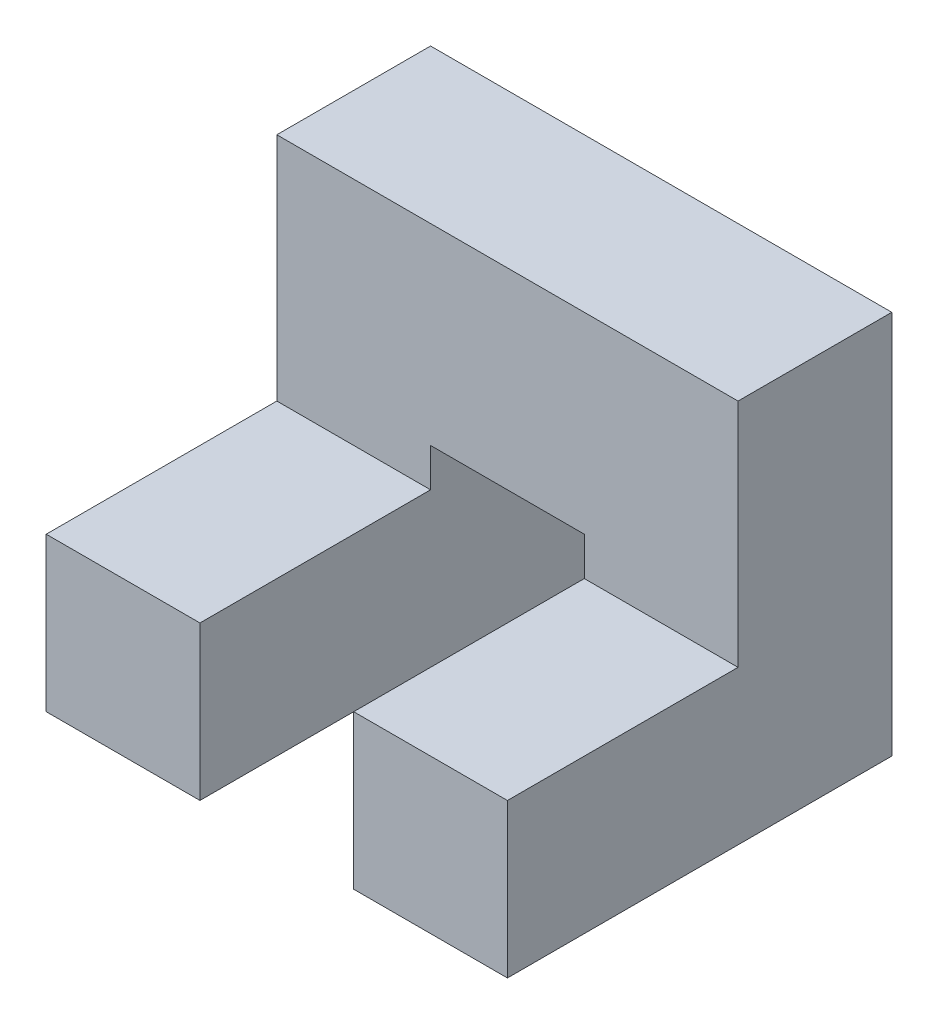
ISO-10303-21;
HEADER;
FILE_DESCRIPTION(('STEP AP214'),'2;1');
FILE_NAME('part.step','',(''),(''),'','','');
FILE_SCHEMA(('AUTOMOTIVE_DESIGN { 1 0 10303 214 1 1 1 1 }'));
ENDSEC;
DATA;
#1=APPLICATION_CONTEXT('core data for automotive mechanical design processes');
#2=APPLICATION_PROTOCOL_DEFINITION('international standard','automotive_design',2000,#1);
#3=PRODUCT_CONTEXT('',#1,'mechanical');
#4=PRODUCT('Part','Part','',(#3));
#5=PRODUCT_RELATED_PRODUCT_CATEGORY('part','',(#4));
#6=PRODUCT_DEFINITION_FORMATION('','',#4);
#7=PRODUCT_DEFINITION_CONTEXT('part definition',#1,'design');
#8=PRODUCT_DEFINITION('design','',#6,#7);
#9=PRODUCT_DEFINITION_SHAPE('','',#8);
#10=(LENGTH_UNIT() NAMED_UNIT(*) SI_UNIT(.MILLI.,.METRE.));
#11=(NAMED_UNIT(*) PLANE_ANGLE_UNIT() SI_UNIT($,.RADIAN.));
#12=(NAMED_UNIT(*) SI_UNIT($,.STERADIAN.) SOLID_ANGLE_UNIT());
#13=UNCERTAINTY_MEASURE_WITH_UNIT(LENGTH_MEASURE(1.E-05),#10,'distance_accuracy_value','');
#14=(GEOMETRIC_REPRESENTATION_CONTEXT(3) GLOBAL_UNCERTAINTY_ASSIGNED_CONTEXT((#13)) GLOBAL_UNIT_ASSIGNED_CONTEXT((#10,
#11,#12)) REPRESENTATION_CONTEXT('',''));
#15=CARTESIAN_POINT('',(0.,0.,0.));
#16=DIRECTION('',(0.,0.,1.));
#17=DIRECTION('',(1.,0.,0.));
#18=AXIS2_PLACEMENT_3D('',#15,#16,#17);
#19=CARTESIAN_POINT('',(-29.9999999999999,-10.,20.));
#20=DIRECTION('',(0.,0.,-1.));
#21=DIRECTION('',(-1.,0.,0.));
#22=AXIS2_PLACEMENT_3D('',#19,#20,#21);
#23=PLANE('',#22);
#24=DIRECTION('',(-1.,0.,0.));
#25=VECTOR('',#24,1.);
#26=CARTESIAN_POINT('',(-9.99999999999999,-5.,20.));
#27=LINE('',#26,#25);
#28=CARTESIAN_POINT('',(-9.99999999999999,-5.,20.));
#29=VERTEX_POINT('',#28);
#30=CARTESIAN_POINT('',(-29.9999999999999,-5.,20.));
#31=VERTEX_POINT('',#30);
#32=EDGE_CURVE('E59',#29,#31,#27,.T.);
#33=ORIENTED_EDGE('',*,*,#32,.F.);
#34=DIRECTION('',(0.,1.,0.));
#35=VECTOR('',#34,1.);
#36=CARTESIAN_POINT('',(-9.99999999999999,-10.,20.));
#37=LINE('',#36,#35);
#38=CARTESIAN_POINT('',(-9.99999999999999,0.,20.));
#39=VERTEX_POINT('',#38);
#40=EDGE_CURVE('E192',#29,#39,#37,.T.);
#41=ORIENTED_EDGE('',*,*,#40,.T.);
#42=DIRECTION('',(1.,0.,0.));
#43=VECTOR('',#42,1.);
#44=CARTESIAN_POINT('',(-29.9999999999999,0.,20.));
#45=LINE('',#44,#43);
#46=CARTESIAN_POINT('',(10.,0.,20.));
#47=VERTEX_POINT('',#46);
#48=EDGE_CURVE('E11',#39,#47,#45,.T.);
#49=ORIENTED_EDGE('',*,*,#48,.T.);
#50=DIRECTION('',(0.,-1.,0.));
#51=VECTOR('',#50,1.);
#52=CARTESIAN_POINT('',(10.,-10.,20.));
#53=LINE('',#52,#51);
#54=CARTESIAN_POINT('',(10.,-5.,20.));
#55=VERTEX_POINT('',#54);
#56=EDGE_CURVE('E204',#47,#55,#53,.T.);
#57=ORIENTED_EDGE('',*,*,#56,.T.);
#58=DIRECTION('',(-1.,0.,0.));
#59=VECTOR('',#58,1.);
#60=CARTESIAN_POINT('',(10.,-5.,20.));
#61=LINE('',#60,#59);
#62=CARTESIAN_POINT('',(30.,-5.,20.));
#63=VERTEX_POINT('',#62);
#64=EDGE_CURVE('E167',#63,#55,#61,.T.);
#65=ORIENTED_EDGE('',*,*,#64,.F.);
#66=DIRECTION('',(0.,1.,0.));
#67=VECTOR('',#66,1.);
#68=CARTESIAN_POINT('',(30.,-10.,20.));
#69=LINE('',#68,#67);
#70=CARTESIAN_POINT('',(30.,25.,20.));
#71=VERTEX_POINT('',#70);
#72=EDGE_CURVE('E210',#63,#71,#69,.T.);
#73=ORIENTED_EDGE('',*,*,#72,.T.);
#74=DIRECTION('',(-1.,0.,0.));
#75=VECTOR('',#74,1.);
#76=CARTESIAN_POINT('',(-29.9999999999999,25.,20.));
#77=LINE('',#76,#75);
#78=CARTESIAN_POINT('',(-29.9999999999999,25.,20.));
#79=VERTEX_POINT('',#78);
#80=EDGE_CURVE('E207',#71,#79,#77,.T.);
#81=ORIENTED_EDGE('',*,*,#80,.T.);
#82=DIRECTION('',(0.,1.,0.));
#83=VECTOR('',#82,1.);
#84=CARTESIAN_POINT('',(-29.9999999999999,-10.,20.));
#85=LINE('',#84,#83);
#86=EDGE_CURVE('E55',#31,#79,#85,.T.);
#87=ORIENTED_EDGE('',*,*,#86,.F.);
#88=EDGE_LOOP('',(#33,#41,#49,#57,#65,#73,#81,#87));
#89=FACE_BOUND('',#88,.T.);
#90=ADVANCED_FACE('F39',(#89),#23,.F.);
#91=CARTESIAN_POINT('',(-30.,-25.,50.));
#92=DIRECTION('',(0.,1.,0.));
#93=DIRECTION('',(0.,0.,1.));
#94=AXIS2_PLACEMENT_3D('',#91,#92,#93);
#95=PLANE('',#94);
#96=DIRECTION('',(1.,0.,0.));
#97=VECTOR('',#96,1.);
#98=CARTESIAN_POINT('',(-30.,-25.,50.));
#99=LINE('',#98,#97);
#100=CARTESIAN_POINT('',(10.,-25.,50.));
#101=VERTEX_POINT('',#100);
#102=CARTESIAN_POINT('',(30.,-25.,50.));
#103=VERTEX_POINT('',#102);
#104=EDGE_CURVE('E138',#101,#103,#99,.T.);
#105=ORIENTED_EDGE('',*,*,#104,.F.);
#106=DIRECTION('',(0.,0.,-1.));
#107=VECTOR('',#106,1.);
#108=CARTESIAN_POINT('',(10.,-25.,50.));
#109=LINE('',#108,#107);
#110=CARTESIAN_POINT('',(10.,-25.,0.));
#111=VERTEX_POINT('',#110);
#112=EDGE_CURVE('E179',#101,#111,#109,.T.);
#113=ORIENTED_EDGE('',*,*,#112,.T.);
#114=DIRECTION('',(1.,0.,0.));
#115=VECTOR('',#114,1.);
#116=CARTESIAN_POINT('',(-30.,-25.,0.));
#117=LINE('',#116,#115);
#118=CARTESIAN_POINT('',(30.,-25.,0.));
#119=VERTEX_POINT('',#118);
#120=EDGE_CURVE('E233',#111,#119,#117,.T.);
#121=ORIENTED_EDGE('',*,*,#120,.T.);
#122=DIRECTION('',(0.,0.,-1.));
#123=VECTOR('',#122,1.);
#124=CARTESIAN_POINT('',(30.,-25.,50.));
#125=LINE('',#124,#123);
#126=EDGE_CURVE('E222',#103,#119,#125,.T.);
#127=ORIENTED_EDGE('',*,*,#126,.F.);
#128=EDGE_LOOP('',(#105,#113,#121,#127));
#129=FACE_BOUND('',#128,.T.);
#130=ADVANCED_FACE('F265',(#129),#95,.F.);
#131=CARTESIAN_POINT('',(0.,0.,50.));
#132=DIRECTION('',(0.,0.,-1.));
#133=DIRECTION('',(-1.,0.,0.));
#134=AXIS2_PLACEMENT_3D('',#131,#132,#133);
#135=PLANE('',#134);
#136=DIRECTION('',(0.,1.,0.));
#137=VECTOR('',#136,1.);
#138=CARTESIAN_POINT('',(30.,-25.,50.));
#139=LINE('',#138,#137);
#140=CARTESIAN_POINT('',(30.,-5.,50.));
#141=VERTEX_POINT('',#140);
#142=EDGE_CURVE('E139',#103,#141,#139,.T.);
#143=ORIENTED_EDGE('',*,*,#142,.T.);
#144=DIRECTION('',(1.,0.,0.));
#145=VECTOR('',#144,1.);
#146=CARTESIAN_POINT('',(10.,-5.,50.));
#147=LINE('',#146,#145);
#148=CARTESIAN_POINT('',(10.,-5.,50.));
#149=VERTEX_POINT('',#148);
#150=EDGE_CURVE('E156',#149,#141,#147,.T.);
#151=ORIENTED_EDGE('',*,*,#150,.F.);
#152=DIRECTION('',(0.,-1.,0.));
#153=VECTOR('',#152,1.);
#154=CARTESIAN_POINT('',(10.,-25.,50.));
#155=LINE('',#154,#153);
#156=EDGE_CURVE('E172',#149,#101,#155,.T.);
#157=ORIENTED_EDGE('',*,*,#156,.T.);
#158=ORIENTED_EDGE('',*,*,#104,.T.);
#159=EDGE_LOOP('',(#143,#151,#157,#158));
#160=FACE_BOUND('',#159,.T.);
#161=ADVANCED_FACE('F269',(#160),#135,.F.);
#162=CARTESIAN_POINT('',(30.,-25.,50.));
#163=DIRECTION('',(-1.,0.,0.));
#164=DIRECTION('',(0.,0.,1.));
#165=AXIS2_PLACEMENT_3D('',#162,#163,#164);
#166=PLANE('',#165);
#167=DIRECTION('',(0.,0.,-1.));
#168=VECTOR('',#167,1.);
#169=CARTESIAN_POINT('',(30.,25.,50.));
#170=LINE('',#169,#168);
#171=CARTESIAN_POINT('',(30.,25.,0.));
#172=VERTEX_POINT('',#171);
#173=EDGE_CURVE('E48',#71,#172,#170,.T.);
#174=ORIENTED_EDGE('',*,*,#173,.F.);
#175=ORIENTED_EDGE('',*,*,#72,.F.);
#176=DIRECTION('',(0.,0.,-1.));
#177=VECTOR('',#176,1.);
#178=CARTESIAN_POINT('',(30.,-5.,20.));
#179=LINE('',#178,#177);
#180=EDGE_CURVE('E163',#141,#63,#179,.T.);
#181=ORIENTED_EDGE('',*,*,#180,.F.);
#182=ORIENTED_EDGE('',*,*,#142,.F.);
#183=ORIENTED_EDGE('',*,*,#126,.T.);
#184=DIRECTION('',(0.,1.,0.));
#185=VECTOR('',#184,1.);
#186=CARTESIAN_POINT('',(30.,-25.,0.));
#187=LINE('',#186,#185);
#188=EDGE_CURVE('E213',#119,#172,#187,.T.);
#189=ORIENTED_EDGE('',*,*,#188,.T.);
#190=EDGE_LOOP('',(#174,#175,#181,#182,#183,#189));
#191=FACE_BOUND('',#190,.T.);
#192=ADVANCED_FACE('F41',(#191),#166,.F.);
#193=CARTESIAN_POINT('',(-30.,25.,50.));
#194=DIRECTION('',(0.,-1.,0.));
#195=DIRECTION('',(0.,0.,-1.));
#196=AXIS2_PLACEMENT_3D('',#193,#194,#195);
#197=PLANE('',#196);
#198=DIRECTION('',(0.,0.,-1.));
#199=VECTOR('',#198,1.);
#200=CARTESIAN_POINT('',(-30.,25.,50.));
#201=LINE('',#200,#199);
#202=CARTESIAN_POINT('',(-30.,25.,0.));
#203=VERTEX_POINT('',#202);
#204=EDGE_CURVE('E242',#79,#203,#201,.T.);
#205=ORIENTED_EDGE('',*,*,#204,.F.);
#206=ORIENTED_EDGE('',*,*,#80,.F.);
#207=ORIENTED_EDGE('',*,*,#173,.T.);
#208=DIRECTION('',(-1.,0.,0.));
#209=VECTOR('',#208,1.);
#210=CARTESIAN_POINT('',(-30.,25.,0.));
#211=LINE('',#210,#209);
#212=EDGE_CURVE('E226',#172,#203,#211,.T.);
#213=ORIENTED_EDGE('',*,*,#212,.T.);
#214=EDGE_LOOP('',(#205,#206,#207,#213));
#215=FACE_BOUND('',#214,.T.);
#216=ADVANCED_FACE('F250',(#215),#197,.F.);
#217=CARTESIAN_POINT('',(-30.,-25.,50.));
#218=DIRECTION('',(1.,0.,0.));
#219=DIRECTION('',(0.,0.,-1.));
#220=AXIS2_PLACEMENT_3D('',#217,#218,#219);
#221=PLANE('',#220);
#222=DIRECTION('',(0.,0.,1.));
#223=VECTOR('',#222,1.);
#224=CARTESIAN_POINT('',(-30.,-5.,20.));
#225=LINE('',#224,#223);
#226=CARTESIAN_POINT('',(-30.,-5.,50.));
#227=VERTEX_POINT('',#226);
#228=EDGE_CURVE('E130',#31,#227,#225,.T.);
#229=ORIENTED_EDGE('',*,*,#228,.F.);
#230=ORIENTED_EDGE('',*,*,#86,.T.);
#231=ORIENTED_EDGE('',*,*,#204,.T.);
#232=DIRECTION('',(0.,-1.,0.));
#233=VECTOR('',#232,1.);
#234=CARTESIAN_POINT('',(-30.,-25.,0.));
#235=LINE('',#234,#233);
#236=CARTESIAN_POINT('',(-30.,-25.,0.));
#237=VERTEX_POINT('',#236);
#238=EDGE_CURVE('E230',#203,#237,#235,.T.);
#239=ORIENTED_EDGE('',*,*,#238,.T.);
#240=DIRECTION('',(0.,0.,-1.));
#241=VECTOR('',#240,1.);
#242=CARTESIAN_POINT('',(-30.,-25.,50.));
#243=LINE('',#242,#241);
#244=CARTESIAN_POINT('',(-30.,-25.,50.));
#245=VERTEX_POINT('',#244);
#246=EDGE_CURVE('E132',#245,#237,#243,.T.);
#247=ORIENTED_EDGE('',*,*,#246,.F.);
#248=DIRECTION('',(0.,-1.,0.));
#249=VECTOR('',#248,1.);
#250=CARTESIAN_POINT('',(-30.,-25.,50.));
#251=LINE('',#250,#249);
#252=EDGE_CURVE('E127',#227,#245,#251,.T.);
#253=ORIENTED_EDGE('',*,*,#252,.F.);
#254=EDGE_LOOP('',(#229,#230,#231,#239,#247,#253));
#255=FACE_BOUND('',#254,.T.);
#256=ADVANCED_FACE('F129',(#255),#221,.F.);
#257=CARTESIAN_POINT('',(-9.99999999999999,-25.,0.));
#258=VERTEX_POINT('',#257);
#259=EDGE_CURVE('E217',#237,#258,#117,.T.);
#260=ORIENTED_EDGE('',*,*,#259,.T.);
#261=DIRECTION('',(0.,0.,-1.));
#262=VECTOR('',#261,1.);
#263=CARTESIAN_POINT('',(-9.99999999999999,-25.,50.));
#264=LINE('',#263,#262);
#265=CARTESIAN_POINT('',(-9.99999999999999,-25.,50.));
#266=VERTEX_POINT('',#265);
#267=EDGE_CURVE('E196',#266,#258,#264,.T.);
#268=ORIENTED_EDGE('',*,*,#267,.F.);
#269=EDGE_CURVE('E219',#245,#266,#99,.T.);
#270=ORIENTED_EDGE('',*,*,#269,.F.);
#271=ORIENTED_EDGE('',*,*,#246,.T.);
#272=EDGE_LOOP('',(#260,#268,#270,#271));
#273=FACE_BOUND('',#272,.T.);
#274=ADVANCED_FACE('F285',(#273),#95,.F.);
#275=ORIENTED_EDGE('',*,*,#269,.T.);
#276=DIRECTION('',(0.,1.,0.));
#277=VECTOR('',#276,1.);
#278=CARTESIAN_POINT('',(-9.99999999999999,-25.,50.));
#279=LINE('',#278,#277);
#280=CARTESIAN_POINT('',(-9.99999999999999,-5.,50.));
#281=VERTEX_POINT('',#280);
#282=EDGE_CURVE('E150',#266,#281,#279,.T.);
#283=ORIENTED_EDGE('',*,*,#282,.T.);
#284=DIRECTION('',(1.,0.,0.));
#285=VECTOR('',#284,1.);
#286=CARTESIAN_POINT('',(-9.99999999999999,-5.,50.));
#287=LINE('',#286,#285);
#288=EDGE_CURVE('E145',#227,#281,#287,.T.);
#289=ORIENTED_EDGE('',*,*,#288,.F.);
#290=ORIENTED_EDGE('',*,*,#252,.T.);
#291=EDGE_LOOP('',(#275,#283,#289,#290));
#292=FACE_BOUND('',#291,.T.);
#293=ADVANCED_FACE('F149',(#292),#135,.F.);
#294=CARTESIAN_POINT('',(0.,0.,0.));
#295=DIRECTION('',(0.,0.,-1.));
#296=DIRECTION('',(-1.,0.,0.));
#297=AXIS2_PLACEMENT_3D('',#294,#295,#296);
#298=PLANE('',#297);
#299=DIRECTION('',(0.,-1.,0.));
#300=VECTOR('',#299,1.);
#301=CARTESIAN_POINT('',(10.,-25.,0.));
#302=LINE('',#301,#300);
#303=CARTESIAN_POINT('',(10.,0.,0.));
#304=VERTEX_POINT('',#303);
#305=EDGE_CURVE('E171',#304,#111,#302,.T.);
#306=ORIENTED_EDGE('',*,*,#305,.F.);
#307=DIRECTION('',(1.,0.,0.));
#308=VECTOR('',#307,1.);
#309=CARTESIAN_POINT('',(10.,0.,0.));
#310=LINE('',#309,#308);
#311=CARTESIAN_POINT('',(-9.99999999999999,0.,0.));
#312=VERTEX_POINT('',#311);
#313=EDGE_CURVE('E176',#312,#304,#310,.T.);
#314=ORIENTED_EDGE('',*,*,#313,.F.);
#315=DIRECTION('',(0.,1.,0.));
#316=VECTOR('',#315,1.);
#317=CARTESIAN_POINT('',(-9.99999999999999,-25.,0.));
#318=LINE('',#317,#316);
#319=EDGE_CURVE('E182',#258,#312,#318,.T.);
#320=ORIENTED_EDGE('',*,*,#319,.F.);
#321=ORIENTED_EDGE('',*,*,#259,.F.);
#322=ORIENTED_EDGE('',*,*,#238,.F.);
#323=ORIENTED_EDGE('',*,*,#212,.F.);
#324=ORIENTED_EDGE('',*,*,#188,.F.);
#325=ORIENTED_EDGE('',*,*,#120,.F.);
#326=EDGE_LOOP('',(#306,#314,#320,#321,#322,#323,#324,#325));
#327=FACE_BOUND('',#326,.T.);
#328=ADVANCED_FACE('F257',(#327),#298,.T.);
#329=CARTESIAN_POINT('',(10.,0.,50.));
#330=DIRECTION('',(0.,1.,0.));
#331=DIRECTION('',(0.,0.,1.));
#332=AXIS2_PLACEMENT_3D('',#329,#330,#331);
#333=PLANE('',#332);
#334=DIRECTION('',(0.,0.,-1.));
#335=VECTOR('',#334,1.);
#336=CARTESIAN_POINT('',(-9.99999999999999,0.,50.));
#337=LINE('',#336,#335);
#338=EDGE_CURVE('E193',#39,#312,#337,.T.);
#339=ORIENTED_EDGE('',*,*,#338,.T.);
#340=ORIENTED_EDGE('',*,*,#313,.T.);
#341=DIRECTION('',(0.,0.,-1.));
#342=VECTOR('',#341,1.);
#343=CARTESIAN_POINT('',(10.,0.,50.));
#344=LINE('',#343,#342);
#345=EDGE_CURVE('E189',#47,#304,#344,.T.);
#346=ORIENTED_EDGE('',*,*,#345,.F.);
#347=ORIENTED_EDGE('',*,*,#48,.F.);
#348=EDGE_LOOP('',(#339,#340,#346,#347));
#349=FACE_BOUND('',#348,.T.);
#350=ADVANCED_FACE('F278',(#349),#333,.F.);
#351=CARTESIAN_POINT('',(10.,-25.,50.));
#352=DIRECTION('',(1.,0.,0.));
#353=DIRECTION('',(0.,0.,-1.));
#354=AXIS2_PLACEMENT_3D('',#351,#352,#353);
#355=PLANE('',#354);
#356=ORIENTED_EDGE('',*,*,#345,.T.);
#357=ORIENTED_EDGE('',*,*,#305,.T.);
#358=ORIENTED_EDGE('',*,*,#112,.F.);
#359=ORIENTED_EDGE('',*,*,#156,.F.);
#360=DIRECTION('',(0.,0.,1.));
#361=VECTOR('',#360,1.);
#362=CARTESIAN_POINT('',(10.,-5.,20.));
#363=LINE('',#362,#361);
#364=EDGE_CURVE('E152',#55,#149,#363,.T.);
#365=ORIENTED_EDGE('',*,*,#364,.F.);
#366=ORIENTED_EDGE('',*,*,#56,.F.);
#367=EDGE_LOOP('',(#356,#357,#358,#359,#365,#366));
#368=FACE_BOUND('',#367,.T.);
#369=ADVANCED_FACE('F273',(#368),#355,.F.);
#370=CARTESIAN_POINT('',(-9.99999999999999,-25.,50.));
#371=DIRECTION('',(-1.,0.,0.));
#372=DIRECTION('',(0.,0.,1.));
#373=AXIS2_PLACEMENT_3D('',#370,#371,#372);
#374=PLANE('',#373);
#375=ORIENTED_EDGE('',*,*,#40,.F.);
#376=DIRECTION('',(0.,0.,-1.));
#377=VECTOR('',#376,1.);
#378=CARTESIAN_POINT('',(-9.99999999999999,-5.,20.));
#379=LINE('',#378,#377);
#380=EDGE_CURVE('E321',#281,#29,#379,.T.);
#381=ORIENTED_EDGE('',*,*,#380,.F.);
#382=ORIENTED_EDGE('',*,*,#282,.F.);
#383=ORIENTED_EDGE('',*,*,#267,.T.);
#384=ORIENTED_EDGE('',*,*,#319,.T.);
#385=ORIENTED_EDGE('',*,*,#338,.F.);
#386=EDGE_LOOP('',(#375,#381,#382,#383,#384,#385));
#387=FACE_BOUND('',#386,.T.);
#388=ADVANCED_FACE('F282',(#387),#374,.F.);
#389=CARTESIAN_POINT('',(0.,-5.,0.));
#390=DIRECTION('',(0.,1.,0.));
#391=DIRECTION('',(0.,0.,1.));
#392=AXIS2_PLACEMENT_3D('',#389,#390,#391);
#393=PLANE('',#392);
#394=ORIENTED_EDGE('',*,*,#364,.T.);
#395=ORIENTED_EDGE('',*,*,#150,.T.);
#396=ORIENTED_EDGE('',*,*,#180,.T.);
#397=ORIENTED_EDGE('',*,*,#64,.T.);
#398=EDGE_LOOP('',(#394,#395,#396,#397));
#399=FACE_BOUND('',#398,.T.);
#400=ADVANCED_FACE('F311',(#399),#393,.T.);
#401=CARTESIAN_POINT('',(0.,-5.,0.));
#402=DIRECTION('',(0.,-1.,0.));
#403=DIRECTION('',(0.,0.,-1.));
#404=AXIS2_PLACEMENT_3D('',#401,#402,#403);
#405=PLANE('',#404);
#406=ORIENTED_EDGE('',*,*,#380,.T.);
#407=ORIENTED_EDGE('',*,*,#32,.T.);
#408=ORIENTED_EDGE('',*,*,#228,.T.);
#409=ORIENTED_EDGE('',*,*,#288,.T.);
#410=EDGE_LOOP('',(#406,#407,#408,#409));
#411=FACE_BOUND('',#410,.T.);
#412=ADVANCED_FACE('F144',(#411),#405,.F.);
#413=CLOSED_SHELL('',(#90,#130,#161,#192,#216,#256,#274,#293,#328,#350,#369,#388,#400,#412));
#414=MANIFOLD_SOLID_BREP('B2',#413);
#415=ADVANCED_BREP_SHAPE_REPRESENTATION('',(#18,#414),#14);
#416=SHAPE_DEFINITION_REPRESENTATION(#9,#415);
ENDSEC;
END-ISO-10303-21;
